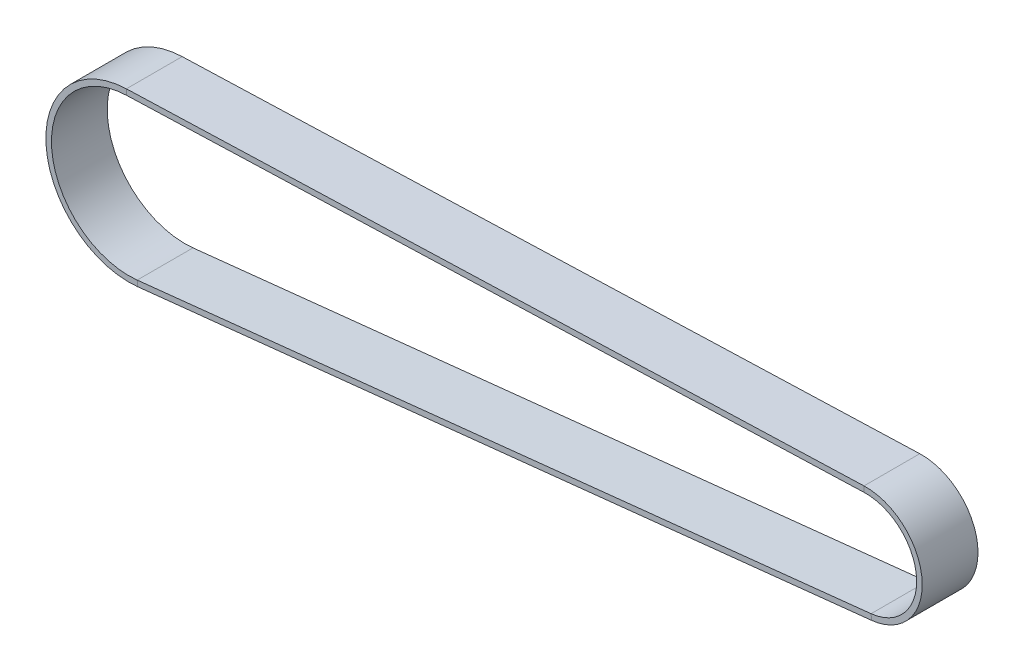
ISO-10303-21;
HEADER;
FILE_DESCRIPTION(('STEP AP214'),'2;1');
FILE_NAME('part.step','',(''),(''),'','','');
FILE_SCHEMA(('AUTOMOTIVE_DESIGN { 1 0 10303 214 1 1 1 1 }'));
ENDSEC;
DATA;
#1=APPLICATION_CONTEXT('core data for automotive mechanical design processes');
#2=APPLICATION_PROTOCOL_DEFINITION('international standard','automotive_design',2000,#1);
#3=PRODUCT_CONTEXT('',#1,'mechanical');
#4=PRODUCT('Part','Part','',(#3));
#5=PRODUCT_RELATED_PRODUCT_CATEGORY('part','',(#4));
#6=PRODUCT_DEFINITION_FORMATION('','',#4);
#7=PRODUCT_DEFINITION_CONTEXT('part definition',#1,'design');
#8=PRODUCT_DEFINITION('design','',#6,#7);
#9=PRODUCT_DEFINITION_SHAPE('','',#8);
#10=(LENGTH_UNIT() NAMED_UNIT(*) SI_UNIT(.MILLI.,.METRE.));
#11=(NAMED_UNIT(*) PLANE_ANGLE_UNIT() SI_UNIT($,.RADIAN.));
#12=(NAMED_UNIT(*) SI_UNIT($,.STERADIAN.) SOLID_ANGLE_UNIT());
#13=UNCERTAINTY_MEASURE_WITH_UNIT(LENGTH_MEASURE(1.E-05),#10,'distance_accuracy_value','');
#14=(GEOMETRIC_REPRESENTATION_CONTEXT(3) GLOBAL_UNCERTAINTY_ASSIGNED_CONTEXT((#13)) GLOBAL_UNIT_ASSIGNED_CONTEXT((#10,
#11,#12)) REPRESENTATION_CONTEXT('',''));
#15=CARTESIAN_POINT('',(0.,0.,0.));
#16=DIRECTION('',(0.,0.,1.));
#17=DIRECTION('',(1.,0.,0.));
#18=AXIS2_PLACEMENT_3D('',#15,#16,#17);
#19=CARTESIAN_POINT('',(-132.546701075712,5.65707085125969,5.));
#20=DIRECTION('',(-0.0337660971382002,0.99942976275677,0.));
#21=DIRECTION('',(-0.99942976275677,-0.0337660971382002,0.));
#22=AXIS2_PLACEMENT_3D('',#19,#20,#21);
#23=PLANE('',#22);
#24=DIRECTION('',(0.99942976275677,0.0337660971382002,0.));
#25=VECTOR('',#24,1.);
#26=CARTESIAN_POINT('',(-132.546701075712,5.65707085125969,-5.));
#27=LINE('',#26,#25);
#28=CARTESIAN_POINT('',(-132.546701075712,5.65707085125969,-5.));
#29=VERTEX_POINT('',#28);
#30=CARTESIAN_POINT('',(-0.308284467001938,10.1247937338513,-5.));
#31=VERTEX_POINT('',#30);
#32=EDGE_CURVE('E11',#29,#31,#27,.T.);
#33=ORIENTED_EDGE('',*,*,#32,.F.);
#34=DIRECTION('',(0.,0.,1.));
#35=VECTOR('',#34,1.);
#36=CARTESIAN_POINT('',(-132.546701075712,5.65707085125969,5.));
#37=LINE('',#36,#35);
#38=CARTESIAN_POINT('',(-132.546701075712,5.65707085125968,5.));
#39=VERTEX_POINT('',#38);
#40=EDGE_CURVE('E46',#29,#39,#37,.T.);
#41=ORIENTED_EDGE('',*,*,#40,.T.);
#42=DIRECTION('',(0.99942976275677,0.0337660971382002,0.));
#43=VECTOR('',#42,1.);
#44=CARTESIAN_POINT('',(-132.546701075712,5.65707085125969,5.));
#45=LINE('',#44,#43);
#46=CARTESIAN_POINT('',(-0.308284467001938,10.1247937338513,5.));
#47=VERTEX_POINT('',#46);
#48=EDGE_CURVE('E130',#39,#47,#45,.T.);
#49=ORIENTED_EDGE('',*,*,#48,.T.);
#50=DIRECTION('',(0.,0.,1.));
#51=VECTOR('',#50,1.);
#52=CARTESIAN_POINT('',(-0.308284467001938,10.1247937338513,5.));
#53=LINE('',#52,#51);
#54=EDGE_CURVE('E131',#31,#47,#53,.T.);
#55=ORIENTED_EDGE('',*,*,#54,.F.);
#56=EDGE_LOOP('',(#33,#41,#49,#55));
#57=FACE_BOUND('',#56,.T.);
#58=ADVANCED_FACE('F43',(#57),#23,.T.);
#59=CARTESIAN_POINT('',(-132.546701075712,5.65707085125969,-5.));
#60=DIRECTION('',(0.,0.,-1.));
#61=DIRECTION('',(-1.,0.,0.));
#62=AXIS2_PLACEMENT_3D('',#59,#60,#61);
#63=PLANE('',#62);
#64=DIRECTION('',(0.99942976275677,0.0337660971382002,0.));
#65=VECTOR('',#64,1.);
#66=CARTESIAN_POINT('',(-132.546701075712,4.65707085125969,-5.));
#67=LINE('',#66,#65);
#68=CARTESIAN_POINT('',(-132.546701075712,4.65707085125969,-5.));
#69=VERTEX_POINT('',#68);
#70=CARTESIAN_POINT('',(-0.308284467001938,9.12479373385126,-5.));
#71=VERTEX_POINT('',#70);
#72=EDGE_CURVE('E51',#69,#71,#67,.T.);
#73=ORIENTED_EDGE('',*,*,#72,.F.);
#74=DIRECTION('',(0.,1.,0.));
#75=VECTOR('',#74,1.);
#76=CARTESIAN_POINT('',(-132.546701075712,5.65707085125969,-5.));
#77=LINE('',#76,#75);
#78=EDGE_CURVE('E197',#69,#29,#77,.T.);
#79=ORIENTED_EDGE('',*,*,#78,.T.);
#80=ORIENTED_EDGE('',*,*,#32,.T.);
#81=DIRECTION('',(0.,1.,0.));
#82=VECTOR('',#81,1.);
#83=CARTESIAN_POINT('',(-0.308284467001938,10.1247937338513,-5.));
#84=LINE('',#83,#82);
#85=EDGE_CURVE('E157',#71,#31,#84,.T.);
#86=ORIENTED_EDGE('',*,*,#85,.F.);
#87=EDGE_LOOP('',(#73,#79,#80,#86));
#88=FACE_BOUND('',#87,.T.);
#89=ADVANCED_FACE('F240',(#88),#63,.T.);
#90=CARTESIAN_POINT('',(-132.546701075712,4.65707085125969,5.));
#91=DIRECTION('',(0.0337660971382002,-0.99942976275677,0.));
#92=DIRECTION('',(0.99942976275677,0.0337660971382002,0.));
#93=AXIS2_PLACEMENT_3D('',#90,#91,#92);
#94=PLANE('',#93);
#95=DIRECTION('',(0.99942976275677,0.0337660971382002,0.));
#96=VECTOR('',#95,1.);
#97=CARTESIAN_POINT('',(-132.546701075712,4.65707085125969,5.));
#98=LINE('',#97,#96);
#99=CARTESIAN_POINT('',(-132.546701075712,4.65707085125969,5.));
#100=VERTEX_POINT('',#99);
#101=CARTESIAN_POINT('',(-0.308284467001938,9.12479373385126,5.));
#102=VERTEX_POINT('',#101);
#103=EDGE_CURVE('E140',#100,#102,#98,.T.);
#104=ORIENTED_EDGE('',*,*,#103,.F.);
#105=DIRECTION('',(0.,0.,-1.));
#106=VECTOR('',#105,1.);
#107=CARTESIAN_POINT('',(-132.546701075712,4.65707085125969,5.));
#108=LINE('',#107,#106);
#109=EDGE_CURVE('E181',#100,#69,#108,.T.);
#110=ORIENTED_EDGE('',*,*,#109,.T.);
#111=ORIENTED_EDGE('',*,*,#72,.T.);
#112=DIRECTION('',(0.,0.,-1.));
#113=VECTOR('',#112,1.);
#114=CARTESIAN_POINT('',(-0.308284467001938,9.12479373385126,5.));
#115=LINE('',#114,#113);
#116=EDGE_CURVE('E163',#102,#71,#115,.T.);
#117=ORIENTED_EDGE('',*,*,#116,.F.);
#118=EDGE_LOOP('',(#104,#110,#111,#117));
#119=FACE_BOUND('',#118,.T.);
#120=ADVANCED_FACE('F231',(#119),#94,.T.);
#121=CARTESIAN_POINT('',(-132.077183495002,-9.23999999998516,0.));
#122=DIRECTION('',(0.,0.,-1.));
#123=DIRECTION('',(-1.,0.,0.));
#124=AXIS2_PLACEMENT_3D('',#121,#122,#123);
#125=CYLINDRICAL_SURFACE('',#124,14.9044680114926);
#126=ORIENTED_EDGE('',*,*,#40,.F.);
#127=CARTESIAN_POINT('',(-132.077183495002,-9.23999999998516,-5.));
#128=DIRECTION('',(0.,0.,-1.));
#129=DIRECTION('',(0.103467063074014,-0.994632880443251,0.));
#130=AXIS2_PLACEMENT_3D('',#127,#128,#129);
#131=CIRCLE('',#130,14.9044680114926);
#132=CARTESIAN_POINT('',(-130.535061963192,-24.0644739495422,-5.));
#133=VERTEX_POINT('',#132);
#134=EDGE_CURVE('E56',#133,#29,#131,.T.);
#135=ORIENTED_EDGE('',*,*,#134,.F.);
#136=DIRECTION('',(0.,0.,1.));
#137=VECTOR('',#136,1.);
#138=CARTESIAN_POINT('',(-130.535061963172,-24.0644739497303,5.));
#139=LINE('',#138,#137);
#140=CARTESIAN_POINT('',(-130.535061963192,-24.0644739495422,5.));
#141=VERTEX_POINT('',#140);
#142=EDGE_CURVE('E184',#133,#141,#139,.T.);
#143=ORIENTED_EDGE('',*,*,#142,.T.);
#144=CARTESIAN_POINT('',(-132.077183495002,-9.23999999998516,5.));
#145=DIRECTION('',(0.,0.,-1.));
#146=DIRECTION('',(0.103467063074014,-0.994632880443251,0.));
#147=AXIS2_PLACEMENT_3D('',#144,#145,#146);
#148=CIRCLE('',#147,14.9044680114926);
#149=EDGE_CURVE('E182',#141,#39,#148,.T.);
#150=ORIENTED_EDGE('',*,*,#149,.T.);
#151=EDGE_LOOP('',(#126,#135,#143,#150));
#152=FACE_BOUND('',#151,.T.);
#153=ADVANCED_FACE('F211',(#152),#125,.T.);
#154=CARTESIAN_POINT('',(-130.535061963172,-24.0644739497303,-5.));
#155=DIRECTION('',(0.,0.,-1.));
#156=DIRECTION('',(-1.,0.,0.));
#157=AXIS2_PLACEMENT_3D('',#154,#155,#156);
#158=PLANE('',#157);
#159=ORIENTED_EDGE('',*,*,#134,.T.);
#160=ORIENTED_EDGE('',*,*,#78,.F.);
#161=CARTESIAN_POINT('',(-132.077183495002,-9.23999999998516,-5.));
#162=DIRECTION('',(0.,0.,-1.));
#163=DIRECTION('',(0.105720140000963,-0.994395923160477,0.));
#164=AXIS2_PLACEMENT_3D('',#161,#162,#163);
#165=CIRCLE('',#164,13.905000000112);
#166=CARTESIAN_POINT('',(-130.607144948296,-23.0670753114549,-5.));
#167=VERTEX_POINT('',#166);
#168=EDGE_CURVE('E69',#167,#69,#165,.T.);
#169=ORIENTED_EDGE('',*,*,#168,.F.);
#170=DIRECTION('',(0.0720829851045086,-0.997398638087311,0.));
#171=VECTOR('',#170,1.);
#172=CARTESIAN_POINT('',(-130.535061963172,-24.0644739497303,-5.));
#173=LINE('',#172,#171);
#174=EDGE_CURVE('E193',#167,#133,#173,.T.);
#175=ORIENTED_EDGE('',*,*,#174,.T.);
#176=EDGE_LOOP('',(#159,#160,#169,#175));
#177=FACE_BOUND('',#176,.T.);
#178=ADVANCED_FACE('F224',(#177),#158,.T.);
#179=CARTESIAN_POINT('',(-132.077183495002,-9.23999999998516,0.));
#180=DIRECTION('',(0.,0.,-1.));
#181=DIRECTION('',(-1.,0.,0.));
#182=AXIS2_PLACEMENT_3D('',#179,#180,#181);
#183=CYLINDRICAL_SURFACE('',#182,13.905000000112);
#184=ORIENTED_EDGE('',*,*,#168,.T.);
#185=ORIENTED_EDGE('',*,*,#109,.F.);
#186=CARTESIAN_POINT('',(-132.077183495002,-9.23999999998516,5.));
#187=DIRECTION('',(0.,0.,-1.));
#188=DIRECTION('',(0.105720140000963,-0.994395923160477,0.));
#189=AXIS2_PLACEMENT_3D('',#186,#187,#188);
#190=CIRCLE('',#189,13.905000000112);
#191=CARTESIAN_POINT('',(-130.607144948296,-23.0670753114549,5.));
#192=VERTEX_POINT('',#191);
#193=EDGE_CURVE('E98',#192,#100,#190,.T.);
#194=ORIENTED_EDGE('',*,*,#193,.F.);
#195=DIRECTION('',(0.,0.,-1.));
#196=VECTOR('',#195,1.);
#197=CARTESIAN_POINT('',(-130.607144948276,-23.067075311643,5.));
#198=LINE('',#197,#196);
#199=EDGE_CURVE('E174',#192,#167,#198,.T.);
#200=ORIENTED_EDGE('',*,*,#199,.T.);
#201=EDGE_LOOP('',(#184,#185,#194,#200));
#202=FACE_BOUND('',#201,.T.);
#203=ADVANCED_FACE('F223',(#202),#183,.F.);
#204=CARTESIAN_POINT('',(-130.535061963172,-24.0644739497303,5.));
#205=DIRECTION('',(0.,0.,1.));
#206=DIRECTION('',(1.,0.,0.));
#207=AXIS2_PLACEMENT_3D('',#204,#205,#206);
#208=PLANE('',#207);
#209=ORIENTED_EDGE('',*,*,#193,.T.);
#210=DIRECTION('',(0.,-1.,0.));
#211=VECTOR('',#210,1.);
#212=CARTESIAN_POINT('',(-132.546701075712,5.65707085125969,5.));
#213=LINE('',#212,#211);
#214=EDGE_CURVE('E177',#39,#100,#213,.T.);
#215=ORIENTED_EDGE('',*,*,#214,.F.);
#216=ORIENTED_EDGE('',*,*,#149,.F.);
#217=DIRECTION('',(-0.0720829851045086,0.997398638087311,0.));
#218=VECTOR('',#217,1.);
#219=CARTESIAN_POINT('',(-130.535061963172,-24.0644739497303,5.));
#220=LINE('',#219,#218);
#221=EDGE_CURVE('E167',#141,#192,#220,.T.);
#222=ORIENTED_EDGE('',*,*,#221,.T.);
#223=EDGE_LOOP('',(#209,#215,#216,#222));
#224=FACE_BOUND('',#223,.T.);
#225=ADVANCED_FACE('F233',(#224),#208,.T.);
#226=CARTESIAN_POINT('',(1.03730786343463,-10.0762334164153,5.));
#227=DIRECTION('',(0.105720140000964,-0.994395923160477,0.));
#228=DIRECTION('',(0.994395923160477,0.105720140000964,0.));
#229=AXIS2_PLACEMENT_3D('',#226,#227,#228);
#230=PLANE('',#229);
#231=ORIENTED_EDGE('',*,*,#142,.F.);
#232=DIRECTION('',(-0.994395923160477,-0.105720140000964,0.));
#233=VECTOR('',#232,1.);
#234=CARTESIAN_POINT('',(1.03730786343463,-10.0762334164153,-5.));
#235=LINE('',#234,#233);
#236=CARTESIAN_POINT('',(1.03730786345409,-10.0762334166044,-5.));
#237=VERTEX_POINT('',#236);
#238=EDGE_CURVE('E201',#237,#133,#235,.T.);
#239=ORIENTED_EDGE('',*,*,#238,.F.);
#240=DIRECTION('',(0.,0.,1.));
#241=VECTOR('',#240,1.);
#242=CARTESIAN_POINT('',(1.03730786343463,-10.0762334164153,5.));
#243=LINE('',#242,#241);
#244=CARTESIAN_POINT('',(1.03730786345409,-10.0762334166044,5.));
#245=VERTEX_POINT('',#244);
#246=EDGE_CURVE('E178',#237,#245,#243,.T.);
#247=ORIENTED_EDGE('',*,*,#246,.T.);
#248=DIRECTION('',(-0.994395923160477,-0.105720140000964,0.));
#249=VECTOR('',#248,1.);
#250=CARTESIAN_POINT('',(1.03730786343463,-10.0762334164153,5.));
#251=LINE('',#250,#249);
#252=EDGE_CURVE('E173',#245,#141,#251,.T.);
#253=ORIENTED_EDGE('',*,*,#252,.T.);
#254=EDGE_LOOP('',(#231,#239,#247,#253));
#255=FACE_BOUND('',#254,.T.);
#256=ADVANCED_FACE('F217',(#255),#230,.T.);
#257=CARTESIAN_POINT('',(1.03730786343463,-10.0762334164153,-5.));
#258=DIRECTION('',(0.,0.,-1.));
#259=DIRECTION('',(-1.,0.,0.));
#260=AXIS2_PLACEMENT_3D('',#257,#258,#259);
#261=PLANE('',#260);
#262=ORIENTED_EDGE('',*,*,#238,.T.);
#263=ORIENTED_EDGE('',*,*,#174,.F.);
#264=DIRECTION('',(-0.994395923160477,-0.105720140000964,0.));
#265=VECTOR('',#264,1.);
#266=CARTESIAN_POINT('',(0.96522487833012,-9.07883477832803,-5.));
#267=LINE('',#266,#265);
#268=CARTESIAN_POINT('',(0.965224878350115,-9.0788347785161,-5.));
#269=VERTEX_POINT('',#268);
#270=EDGE_CURVE('E107',#269,#167,#267,.T.);
#271=ORIENTED_EDGE('',*,*,#270,.F.);
#272=DIRECTION('',(0.0720829851045088,-0.997398638087311,0.));
#273=VECTOR('',#272,1.);
#274=CARTESIAN_POINT('',(1.03730786343463,-10.0762334164153,-5.));
#275=LINE('',#274,#273);
#276=EDGE_CURVE('E194',#269,#237,#275,.T.);
#277=ORIENTED_EDGE('',*,*,#276,.T.);
#278=EDGE_LOOP('',(#262,#263,#271,#277));
#279=FACE_BOUND('',#278,.T.);
#280=ADVANCED_FACE('F225',(#279),#261,.T.);
#281=CARTESIAN_POINT('',(0.96522487833012,-9.07883477832803,5.));
#282=DIRECTION('',(-0.105720140000964,0.994395923160477,0.));
#283=DIRECTION('',(-0.994395923160477,-0.105720140000964,0.));
#284=AXIS2_PLACEMENT_3D('',#281,#282,#283);
#285=PLANE('',#284);
#286=ORIENTED_EDGE('',*,*,#270,.T.);
#287=ORIENTED_EDGE('',*,*,#199,.F.);
#288=DIRECTION('',(-0.994395923160477,-0.105720140000964,0.));
#289=VECTOR('',#288,1.);
#290=CARTESIAN_POINT('',(0.96522487833012,-9.07883477832803,5.));
#291=LINE('',#290,#289);
#292=CARTESIAN_POINT('',(0.965224878350115,-9.0788347785161,5.));
#293=VERTEX_POINT('',#292);
#294=EDGE_CURVE('E114',#293,#192,#291,.T.);
#295=ORIENTED_EDGE('',*,*,#294,.F.);
#296=DIRECTION('',(0.,0.,-1.));
#297=VECTOR('',#296,1.);
#298=CARTESIAN_POINT('',(0.965224878330122,-9.07883477832803,5.));
#299=LINE('',#298,#297);
#300=EDGE_CURVE('E166',#293,#269,#299,.T.);
#301=ORIENTED_EDGE('',*,*,#300,.T.);
#302=EDGE_LOOP('',(#286,#287,#295,#301));
#303=FACE_BOUND('',#302,.T.);
#304=ADVANCED_FACE('F253',(#303),#285,.T.);
#305=CARTESIAN_POINT('',(1.03730786343463,-10.0762334164153,5.));
#306=DIRECTION('',(0.,0.,1.));
#307=DIRECTION('',(1.,0.,0.));
#308=AXIS2_PLACEMENT_3D('',#305,#306,#307);
#309=PLANE('',#308);
#310=ORIENTED_EDGE('',*,*,#294,.T.);
#311=ORIENTED_EDGE('',*,*,#221,.F.);
#312=ORIENTED_EDGE('',*,*,#252,.F.);
#313=DIRECTION('',(-0.0720829851045088,0.997398638087311,0.));
#314=VECTOR('',#313,1.);
#315=CARTESIAN_POINT('',(1.03730786343463,-10.0762334164153,5.));
#316=LINE('',#315,#314);
#317=EDGE_CURVE('E150',#245,#293,#316,.T.);
#318=ORIENTED_EDGE('',*,*,#317,.T.);
#319=EDGE_LOOP('',(#310,#311,#312,#318));
#320=FACE_BOUND('',#319,.T.);
#321=ADVANCED_FACE('F212',(#320),#309,.T.);
#322=CARTESIAN_POINT('',(-1.30645494422765E-10,-1.0399667238481E-10,0.));
#323=DIRECTION('',(0.,0.,-1.));
#324=DIRECTION('',(-1.,0.,0.));
#325=AXIS2_PLACEMENT_3D('',#322,#323,#324);
#326=CYLINDRICAL_SURFACE('',#325,10.1294860416338);
#327=ORIENTED_EDGE('',*,*,#246,.F.);
#328=CARTESIAN_POINT('',(-1.30645494422765E-10,-1.0399667238481E-10,-5.));
#329=DIRECTION('',(0.,0.,-1.));
#330=DIRECTION('',(-0.0304343641527512,0.99953676744711,0.));
#331=AXIS2_PLACEMENT_3D('',#328,#329,#330);
#332=CIRCLE('',#331,10.1294860416338);
#333=EDGE_CURVE('E155',#31,#237,#332,.T.);
#334=ORIENTED_EDGE('',*,*,#333,.F.);
#335=ORIENTED_EDGE('',*,*,#54,.T.);
#336=CARTESIAN_POINT('',(-1.30645494422765E-10,-1.0399667238481E-10,5.));
#337=DIRECTION('',(0.,0.,-1.));
#338=DIRECTION('',(-0.0304343641527512,0.99953676744711,0.));
#339=AXIS2_PLACEMENT_3D('',#336,#337,#338);
#340=CIRCLE('',#339,10.1294860416338);
#341=EDGE_CURVE('E141',#47,#245,#340,.T.);
#342=ORIENTED_EDGE('',*,*,#341,.T.);
#343=EDGE_LOOP('',(#327,#334,#335,#342));
#344=FACE_BOUND('',#343,.T.);
#345=ADVANCED_FACE('F154',(#344),#326,.T.);
#346=CARTESIAN_POINT('',(-0.308284467001938,10.1247937338513,-5.));
#347=DIRECTION('',(0.,0.,-1.));
#348=DIRECTION('',(-1.,0.,0.));
#349=AXIS2_PLACEMENT_3D('',#346,#347,#348);
#350=PLANE('',#349);
#351=ORIENTED_EDGE('',*,*,#333,.T.);
#352=ORIENTED_EDGE('',*,*,#276,.F.);
#353=CARTESIAN_POINT('',(-1.30645494422765E-10,-1.0399667238481E-10,-5.));
#354=DIRECTION('',(0.,0.,-1.));
#355=DIRECTION('',(-0.0337660971382002,0.99942976275677,0.));
#356=AXIS2_PLACEMENT_3D('',#353,#354,#355);
#357=CIRCLE('',#356,9.12999999998594);
#358=EDGE_CURVE('E189',#71,#269,#357,.T.);
#359=ORIENTED_EDGE('',*,*,#358,.F.);
#360=ORIENTED_EDGE('',*,*,#85,.T.);
#361=EDGE_LOOP('',(#351,#352,#359,#360));
#362=FACE_BOUND('',#361,.T.);
#363=ADVANCED_FACE('F218',(#362),#350,.T.);
#364=CARTESIAN_POINT('',(-1.30645494422765E-10,-1.0399667238481E-10,0.));
#365=DIRECTION('',(0.,0.,-1.));
#366=DIRECTION('',(-1.,0.,0.));
#367=AXIS2_PLACEMENT_3D('',#364,#365,#366);
#368=CYLINDRICAL_SURFACE('',#367,9.12999999998594);
#369=ORIENTED_EDGE('',*,*,#358,.T.);
#370=ORIENTED_EDGE('',*,*,#300,.F.);
#371=CARTESIAN_POINT('',(-1.30645494422765E-10,-1.0399667238481E-10,5.));
#372=DIRECTION('',(0.,0.,-1.));
#373=DIRECTION('',(-0.0337660971382002,0.99942976275677,0.));
#374=AXIS2_PLACEMENT_3D('',#371,#372,#373);
#375=CIRCLE('',#374,9.12999999998594);
#376=EDGE_CURVE('E170',#102,#293,#375,.T.);
#377=ORIENTED_EDGE('',*,*,#376,.F.);
#378=ORIENTED_EDGE('',*,*,#116,.T.);
#379=EDGE_LOOP('',(#369,#370,#377,#378));
#380=FACE_BOUND('',#379,.T.);
#381=ADVANCED_FACE('F263',(#380),#368,.F.);
#382=CARTESIAN_POINT('',(-0.308284467001938,10.1247937338513,5.));
#383=DIRECTION('',(0.,0.,1.));
#384=DIRECTION('',(1.,0.,0.));
#385=AXIS2_PLACEMENT_3D('',#382,#383,#384);
#386=PLANE('',#385);
#387=ORIENTED_EDGE('',*,*,#376,.T.);
#388=ORIENTED_EDGE('',*,*,#317,.F.);
#389=ORIENTED_EDGE('',*,*,#341,.F.);
#390=DIRECTION('',(0.,-1.,0.));
#391=VECTOR('',#390,1.);
#392=CARTESIAN_POINT('',(-0.308284467001938,10.1247937338513,5.));
#393=LINE('',#392,#391);
#394=EDGE_CURVE('E149',#47,#102,#393,.T.);
#395=ORIENTED_EDGE('',*,*,#394,.T.);
#396=EDGE_LOOP('',(#387,#388,#389,#395));
#397=FACE_BOUND('',#396,.T.);
#398=ADVANCED_FACE('F143',(#397),#386,.T.);
#399=CARTESIAN_POINT('',(-132.546701075712,5.65707085125969,5.));
#400=DIRECTION('',(0.,0.,1.));
#401=DIRECTION('',(1.,0.,0.));
#402=AXIS2_PLACEMENT_3D('',#399,#400,#401);
#403=PLANE('',#402);
#404=ORIENTED_EDGE('',*,*,#214,.T.);
#405=ORIENTED_EDGE('',*,*,#103,.T.);
#406=ORIENTED_EDGE('',*,*,#394,.F.);
#407=ORIENTED_EDGE('',*,*,#48,.F.);
#408=EDGE_LOOP('',(#404,#405,#406,#407));
#409=FACE_BOUND('',#408,.T.);
#410=ADVANCED_FACE('F159',(#409),#403,.T.);
#411=CLOSED_SHELL('',(#58,#89,#120,#153,#178,#203,#225,#256,#280,#304,#321,#345,#363,#381,#398,#410));
#412=MANIFOLD_SOLID_BREP('B2',#411);
#413=ADVANCED_BREP_SHAPE_REPRESENTATION('',(#18,#412),#14);
#414=SHAPE_DEFINITION_REPRESENTATION(#9,#413);
ENDSEC;
END-ISO-10303-21;
